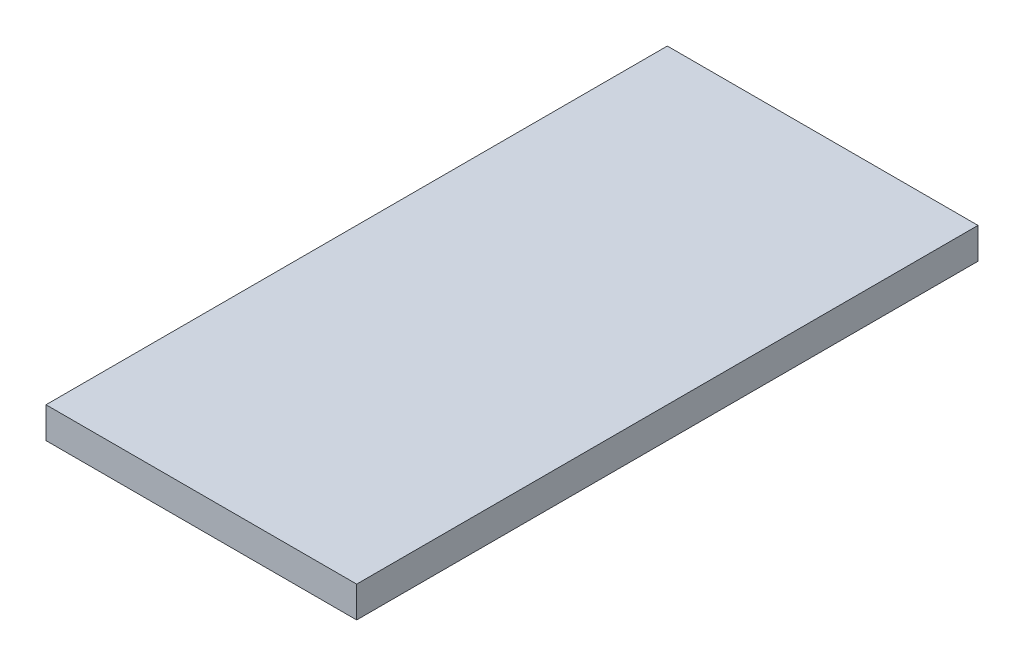
ISO-10303-21;
HEADER;
FILE_DESCRIPTION(('STEP AP214'),'2;1');
FILE_NAME('part.step','',(''),(''),'','','');
FILE_SCHEMA(('AUTOMOTIVE_DESIGN { 1 0 10303 214 1 1 1 1 }'));
ENDSEC;
DATA;
#1=APPLICATION_CONTEXT('core data for automotive mechanical design processes');
#2=APPLICATION_PROTOCOL_DEFINITION('international standard','automotive_design',2000,#1);
#3=PRODUCT_CONTEXT('',#1,'mechanical');
#4=PRODUCT('Part','Part','',(#3));
#5=PRODUCT_RELATED_PRODUCT_CATEGORY('part','',(#4));
#6=PRODUCT_DEFINITION_FORMATION('','',#4);
#7=PRODUCT_DEFINITION_CONTEXT('part definition',#1,'design');
#8=PRODUCT_DEFINITION('design','',#6,#7);
#9=PRODUCT_DEFINITION_SHAPE('','',#8);
#10=(LENGTH_UNIT() NAMED_UNIT(*) SI_UNIT(.MILLI.,.METRE.));
#11=(NAMED_UNIT(*) PLANE_ANGLE_UNIT() SI_UNIT($,.RADIAN.));
#12=(NAMED_UNIT(*) SI_UNIT($,.STERADIAN.) SOLID_ANGLE_UNIT());
#13=UNCERTAINTY_MEASURE_WITH_UNIT(LENGTH_MEASURE(1.E-05),#10,'distance_accuracy_value','');
#14=(GEOMETRIC_REPRESENTATION_CONTEXT(3) GLOBAL_UNCERTAINTY_ASSIGNED_CONTEXT((#13)) GLOBAL_UNIT_ASSIGNED_CONTEXT((#10,
#11,#12)) REPRESENTATION_CONTEXT('',''));
#15=CARTESIAN_POINT('',(0.,0.,0.));
#16=DIRECTION('',(0.,0.,1.));
#17=DIRECTION('',(1.,0.,0.));
#18=AXIS2_PLACEMENT_3D('',#15,#16,#17);
#19=CARTESIAN_POINT('',(0.,5.,0.));
#20=DIRECTION('',(1.,0.,0.));
#21=DIRECTION('',(0.,0.,-1.));
#22=AXIS2_PLACEMENT_3D('',#19,#20,#21);
#23=PLANE('',#22);
#24=DIRECTION('',(0.,0.,1.));
#25=VECTOR('',#24,1.);
#26=CARTESIAN_POINT('',(0.,0.,0.));
#27=LINE('',#26,#25);
#28=CARTESIAN_POINT('',(0.,0.,-100.));
#29=VERTEX_POINT('',#28);
#30=CARTESIAN_POINT('',(0.,0.,0.));
#31=VERTEX_POINT('',#30);
#32=EDGE_CURVE('E96',#29,#31,#27,.T.);
#33=ORIENTED_EDGE('',*,*,#32,.T.);
#34=DIRECTION('',(0.,-1.,0.));
#35=VECTOR('',#34,1.);
#36=CARTESIAN_POINT('',(0.,5.,0.));
#37=LINE('',#36,#35);
#38=CARTESIAN_POINT('',(0.,5.,0.));
#39=VERTEX_POINT('',#38);
#40=EDGE_CURVE('E11',#39,#31,#37,.T.);
#41=ORIENTED_EDGE('',*,*,#40,.F.);
#42=DIRECTION('',(0.,0.,1.));
#43=VECTOR('',#42,1.);
#44=CARTESIAN_POINT('',(0.,5.,0.));
#45=LINE('',#44,#43);
#46=CARTESIAN_POINT('',(0.,5.,-100.));
#47=VERTEX_POINT('',#46);
#48=EDGE_CURVE('E84',#47,#39,#45,.T.);
#49=ORIENTED_EDGE('',*,*,#48,.F.);
#50=DIRECTION('',(0.,-1.,0.));
#51=VECTOR('',#50,1.);
#52=CARTESIAN_POINT('',(0.,5.,-100.));
#53=LINE('',#52,#51);
#54=EDGE_CURVE('E92',#47,#29,#53,.T.);
#55=ORIENTED_EDGE('',*,*,#54,.T.);
#56=EDGE_LOOP('',(#33,#41,#49,#55));
#57=FACE_BOUND('',#56,.T.);
#58=ADVANCED_FACE('F33',(#57),#23,.F.);
#59=CARTESIAN_POINT('',(0.,5.,0.));
#60=DIRECTION('',(0.,0.,-1.));
#61=DIRECTION('',(-1.,0.,0.));
#62=AXIS2_PLACEMENT_3D('',#59,#60,#61);
#63=PLANE('',#62);
#64=DIRECTION('',(1.,0.,0.));
#65=VECTOR('',#64,1.);
#66=CARTESIAN_POINT('',(0.,0.,0.));
#67=LINE('',#66,#65);
#68=CARTESIAN_POINT('',(50.,0.,0.));
#69=VERTEX_POINT('',#68);
#70=EDGE_CURVE('E88',#31,#69,#67,.T.);
#71=ORIENTED_EDGE('',*,*,#70,.T.);
#72=DIRECTION('',(0.,-1.,0.));
#73=VECTOR('',#72,1.);
#74=CARTESIAN_POINT('',(50.,5.,0.));
#75=LINE('',#74,#73);
#76=CARTESIAN_POINT('',(50.,5.,0.));
#77=VERTEX_POINT('',#76);
#78=EDGE_CURVE('E41',#77,#69,#75,.T.);
#79=ORIENTED_EDGE('',*,*,#78,.F.);
#80=DIRECTION('',(1.,0.,0.));
#81=VECTOR('',#80,1.);
#82=CARTESIAN_POINT('',(0.,5.,0.));
#83=LINE('',#82,#81);
#84=EDGE_CURVE('E79',#39,#77,#83,.T.);
#85=ORIENTED_EDGE('',*,*,#84,.F.);
#86=ORIENTED_EDGE('',*,*,#40,.T.);
#87=EDGE_LOOP('',(#71,#79,#85,#86));
#88=FACE_BOUND('',#87,.T.);
#89=ADVANCED_FACE('F87',(#88),#63,.F.);
#90=CARTESIAN_POINT('',(50.,5.,0.));
#91=DIRECTION('',(-1.,0.,0.));
#92=DIRECTION('',(0.,0.,1.));
#93=AXIS2_PLACEMENT_3D('',#90,#91,#92);
#94=PLANE('',#93);
#95=DIRECTION('',(0.,0.,-1.));
#96=VECTOR('',#95,1.);
#97=CARTESIAN_POINT('',(50.,0.,0.));
#98=LINE('',#97,#96);
#99=CARTESIAN_POINT('',(50.,0.,-100.));
#100=VERTEX_POINT('',#99);
#101=EDGE_CURVE('E66',#69,#100,#98,.T.);
#102=ORIENTED_EDGE('',*,*,#101,.T.);
#103=DIRECTION('',(0.,-1.,0.));
#104=VECTOR('',#103,1.);
#105=CARTESIAN_POINT('',(50.,5.,-100.));
#106=LINE('',#105,#104);
#107=CARTESIAN_POINT('',(50.,5.,-100.));
#108=VERTEX_POINT('',#107);
#109=EDGE_CURVE('E89',#108,#100,#106,.T.);
#110=ORIENTED_EDGE('',*,*,#109,.F.);
#111=DIRECTION('',(0.,0.,-1.));
#112=VECTOR('',#111,1.);
#113=CARTESIAN_POINT('',(50.,5.,0.));
#114=LINE('',#113,#112);
#115=EDGE_CURVE('E82',#77,#108,#114,.T.);
#116=ORIENTED_EDGE('',*,*,#115,.F.);
#117=ORIENTED_EDGE('',*,*,#78,.T.);
#118=EDGE_LOOP('',(#102,#110,#116,#117));
#119=FACE_BOUND('',#118,.T.);
#120=ADVANCED_FACE('F90',(#119),#94,.F.);
#121=CARTESIAN_POINT('',(0.,5.,-100.));
#122=DIRECTION('',(0.,0.,1.));
#123=DIRECTION('',(1.,0.,0.));
#124=AXIS2_PLACEMENT_3D('',#121,#122,#123);
#125=PLANE('',#124);
#126=DIRECTION('',(-1.,0.,0.));
#127=VECTOR('',#126,1.);
#128=CARTESIAN_POINT('',(0.,0.,-100.));
#129=LINE('',#128,#127);
#130=EDGE_CURVE('E72',#100,#29,#129,.T.);
#131=ORIENTED_EDGE('',*,*,#130,.T.);
#132=ORIENTED_EDGE('',*,*,#54,.F.);
#133=DIRECTION('',(-1.,0.,0.));
#134=VECTOR('',#133,1.);
#135=CARTESIAN_POINT('',(0.,5.,-100.));
#136=LINE('',#135,#134);
#137=EDGE_CURVE('E49',#108,#47,#136,.T.);
#138=ORIENTED_EDGE('',*,*,#137,.F.);
#139=ORIENTED_EDGE('',*,*,#109,.T.);
#140=EDGE_LOOP('',(#131,#132,#138,#139));
#141=FACE_BOUND('',#140,.T.);
#142=ADVANCED_FACE('F103',(#141),#125,.F.);
#143=CARTESIAN_POINT('',(0.,5.,0.));
#144=DIRECTION('',(0.,-1.,0.));
#145=DIRECTION('',(0.,0.,-1.));
#146=AXIS2_PLACEMENT_3D('',#143,#144,#145);
#147=PLANE('',#146);
#148=ORIENTED_EDGE('',*,*,#48,.T.);
#149=ORIENTED_EDGE('',*,*,#84,.T.);
#150=ORIENTED_EDGE('',*,*,#115,.T.);
#151=ORIENTED_EDGE('',*,*,#137,.T.);
#152=EDGE_LOOP('',(#148,#149,#150,#151));
#153=FACE_BOUND('',#152,.T.);
#154=ADVANCED_FACE('F80',(#153),#147,.F.);
#155=CARTESIAN_POINT('',(0.,0.,0.));
#156=DIRECTION('',(0.,-1.,0.));
#157=DIRECTION('',(0.,0.,-1.));
#158=AXIS2_PLACEMENT_3D('',#155,#156,#157);
#159=PLANE('',#158);
#160=ORIENTED_EDGE('',*,*,#32,.F.);
#161=ORIENTED_EDGE('',*,*,#130,.F.);
#162=ORIENTED_EDGE('',*,*,#101,.F.);
#163=ORIENTED_EDGE('',*,*,#70,.F.);
#164=EDGE_LOOP('',(#160,#161,#162,#163));
#165=FACE_BOUND('',#164,.T.);
#166=ADVANCED_FACE('F106',(#165),#159,.T.);
#167=CLOSED_SHELL('',(#58,#89,#120,#142,#154,#166));
#168=MANIFOLD_SOLID_BREP('B2',#167);
#169=ADVANCED_BREP_SHAPE_REPRESENTATION('',(#18,#168),#14);
#170=SHAPE_DEFINITION_REPRESENTATION(#9,#169);
ENDSEC;
END-ISO-10303-21;
